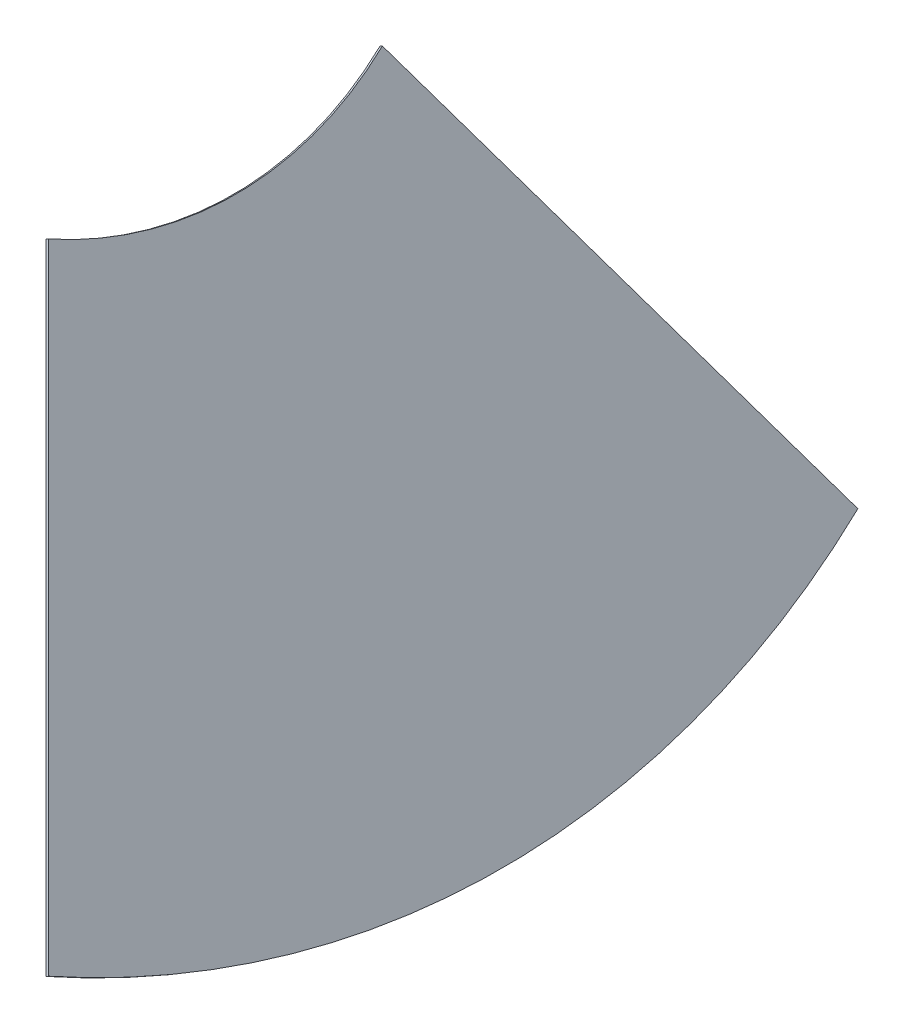
ISO-10303-21;
HEADER;
FILE_DESCRIPTION(('STEP AP214'),'2;1');
FILE_NAME('part.step','',(''),(''),'','','');
FILE_SCHEMA(('AUTOMOTIVE_DESIGN { 1 0 10303 214 1 1 1 1 }'));
ENDSEC;
DATA;
#1=APPLICATION_CONTEXT('core data for automotive mechanical design processes');
#2=APPLICATION_PROTOCOL_DEFINITION('international standard','automotive_design',2000,#1);
#3=PRODUCT_CONTEXT('',#1,'mechanical');
#4=PRODUCT('Part','Part','',(#3));
#5=PRODUCT_RELATED_PRODUCT_CATEGORY('part','',(#4));
#6=PRODUCT_DEFINITION_FORMATION('','',#4);
#7=PRODUCT_DEFINITION_CONTEXT('part definition',#1,'design');
#8=PRODUCT_DEFINITION('design','',#6,#7);
#9=PRODUCT_DEFINITION_SHAPE('','',#8);
#10=(LENGTH_UNIT() NAMED_UNIT(*) SI_UNIT(.MILLI.,.METRE.));
#11=(NAMED_UNIT(*) PLANE_ANGLE_UNIT() SI_UNIT($,.RADIAN.));
#12=(NAMED_UNIT(*) SI_UNIT($,.STERADIAN.) SOLID_ANGLE_UNIT());
#13=UNCERTAINTY_MEASURE_WITH_UNIT(LENGTH_MEASURE(1.E-05),#10,'distance_accuracy_value','');
#14=(GEOMETRIC_REPRESENTATION_CONTEXT(3) GLOBAL_UNCERTAINTY_ASSIGNED_CONTEXT((#13)) GLOBAL_UNIT_ASSIGNED_CONTEXT((#10,
#11,#12)) REPRESENTATION_CONTEXT('',''));
#15=CARTESIAN_POINT('',(0.,0.,0.));
#16=DIRECTION('',(0.,0.,1.));
#17=DIRECTION('',(1.,0.,0.));
#18=AXIS2_PLACEMENT_3D('',#15,#16,#17);
#19=CARTESIAN_POINT('',(38.5485374578257,22.87212089029,0.));
#20=DIRECTION('',(-0.860012120645906,-0.510273605374736,0.));
#21=DIRECTION('',(0.510273605374736,-0.860012120645906,0.));
#22=AXIS2_PLACEMENT_3D('',#19,#20,#21);
#23=PLANE('',#22);
#24=DIRECTION('',(-0.454519477672044,0.766044443118981,-0.454519477672039));
#25=VECTOR('',#24,1.);
#26=CARTESIAN_POINT('',(31.0734881622372,35.4705248228444,28.7083248729783));
#27=LINE('',#26,#25);
#28=CARTESIAN_POINT('',(180.235728869206,-215.926634660816,177.870565579945));
#29=VERTEX_POINT('',#28);
#30=CARTESIAN_POINT('',(75.6914234349291,-39.7282797567691,73.3262601456698));
#31=VERTEX_POINT('',#30);
#32=EDGE_CURVE('E127',#29,#31,#27,.T.);
#33=ORIENTED_EDGE('',*,*,#32,.F.);
#34=CARTESIAN_POINT('',(2.36512788773338,83.8554256679726,-3.54015250359858E-05));
#35=DIRECTION('',(-0.860012120645906,-0.510273605374736,0.));
#36=DIRECTION('',(0.510273605374736,-0.860012120645906,0.));
#37=AXIS2_PLACEMENT_3D('',#34,#35,#36);
#38=CIRCLE('',#37,391.337686764248);
#39=CARTESIAN_POINT('',(180.198905696345,-215.864573102768,-178.011986936182));
#40=VERTEX_POINT('',#39);
#41=EDGE_CURVE('E132',#29,#40,#38,.F.);
#42=ORIENTED_EDGE('',*,*,#41,.T.);
#43=DIRECTION('',(0.454519477672044,-0.76604444311898,-0.45451947767204));
#44=VECTOR('',#43,1.);
#45=CARTESIAN_POINT('',(31.0366649893771,35.5325863808923,-28.8497462292153));
#46=LINE('',#45,#44);
#47=CARTESIAN_POINT('',(75.6546002620691,-39.6662181987212,-73.4676815019069));
#48=VERTEX_POINT('',#47);
#49=EDGE_CURVE('E130',#48,#40,#46,.T.);
#50=ORIENTED_EDGE('',*,*,#49,.F.);
#51=CARTESIAN_POINT('',(2.36507751146295,83.8555105718413,-8.57777956146195E-05));
#52=DIRECTION('',(-0.860012120645906,-0.510273605374736,0.));
#53=DIRECTION('',(0.510273605374736,-0.860012120645906,0.));
#54=AXIS2_PLACEMENT_3D('',#51,#52,#53);
#55=CIRCLE('',#54,161.32718073828);
#56=EDGE_CURVE('E118',#31,#48,#55,.F.);
#57=ORIENTED_EDGE('',*,*,#56,.F.);
#58=EDGE_LOOP('',(#33,#42,#50,#57));
#59=FACE_BOUND('',#58,.T.);
#60=ADVANCED_FACE('F63',(#59),#23,.F.);
#61=CARTESIAN_POINT('',(1.27286211824265,83.2074630930153,-8.5777795613985E-05));
#62=DIRECTION('',(0.860012120645906,0.510273605374736,0.));
#63=DIRECTION('',(-0.510273605374736,0.860012120645906,0.));
#64=AXIS2_PLACEMENT_3D('',#61,#62,#63);
#65=CYLINDRICAL_SURFACE('',#64,161.32718073828);
#66=ORIENTED_EDGE('',*,*,#56,.T.);
#67=DIRECTION('',(0.860012120645906,0.510273605374736,0.));
#68=VECTOR('',#67,1.);
#69=CARTESIAN_POINT('',(74.5623848688488,-40.3142656775472,-73.4676815019069));
#70=LINE('',#69,#68);
#71=CARTESIAN_POINT('',(74.5623848688488,-40.3142656775472,-73.4676815019069));
#72=VERTEX_POINT('',#71);
#73=EDGE_CURVE('E72',#72,#48,#70,.T.);
#74=ORIENTED_EDGE('',*,*,#73,.F.);
#75=CARTESIAN_POINT('',(1.27286211824265,83.2074630930153,-8.5777795613985E-05));
#76=DIRECTION('',(-0.860012120645906,-0.510273605374736,0.));
#77=DIRECTION('',(0.510273605374736,-0.860012120645906,0.));
#78=AXIS2_PLACEMENT_3D('',#75,#76,#77);
#79=CIRCLE('',#78,161.32718073828);
#80=CARTESIAN_POINT('',(74.5992080417089,-40.376327235595,73.3262601456698));
#81=VERTEX_POINT('',#80);
#82=EDGE_CURVE('E106',#81,#72,#79,.F.);
#83=ORIENTED_EDGE('',*,*,#82,.F.);
#84=DIRECTION('',(0.860012120645906,0.510273605374736,0.));
#85=VECTOR('',#84,1.);
#86=CARTESIAN_POINT('',(74.5992080417089,-40.376327235595,73.3262601456698));
#87=LINE('',#86,#85);
#88=EDGE_CURVE('E12',#81,#31,#87,.T.);
#89=ORIENTED_EDGE('',*,*,#88,.T.);
#90=EDGE_LOOP('',(#66,#74,#83,#89));
#91=FACE_BOUND('',#90,.T.);
#92=ADVANCED_FACE('F117',(#91),#65,.F.);
#93=CARTESIAN_POINT('',(29.9812727690169,34.8224773440185,28.7083248729783));
#94=DIRECTION('',(0.231929292584753,-0.3908922598676,-0.890736798620522));
#95=DIRECTION('',(0.,0.915705667983333,-0.401849635589231));
#96=AXIS2_PLACEMENT_3D('',#93,#94,#95);
#97=PLANE('',#96);
#98=ORIENTED_EDGE('',*,*,#32,.T.);
#99=ORIENTED_EDGE('',*,*,#88,.F.);
#100=DIRECTION('',(-0.454519477672044,0.766044443118981,-0.454519477672039));
#101=VECTOR('',#100,1.);
#102=CARTESIAN_POINT('',(29.9812727690169,34.8224773440185,28.7083248729783));
#103=LINE('',#102,#101);
#104=CARTESIAN_POINT('',(179.143513475985,-216.574682139642,177.870565579945));
#105=VERTEX_POINT('',#104);
#106=EDGE_CURVE('E113',#105,#81,#103,.T.);
#107=ORIENTED_EDGE('',*,*,#106,.F.);
#108=DIRECTION('',(0.860012120645906,0.510273605374736,0.));
#109=VECTOR('',#108,1.);
#110=CARTESIAN_POINT('',(179.143513475985,-216.574682139642,177.870565579945));
#111=LINE('',#110,#109);
#112=EDGE_CURVE('E80',#105,#29,#111,.T.);
#113=ORIENTED_EDGE('',*,*,#112,.T.);
#114=EDGE_LOOP('',(#98,#99,#107,#113));
#115=FACE_BOUND('',#114,.T.);
#116=ADVANCED_FACE('F65',(#115),#97,.F.);
#117=CARTESIAN_POINT('',(1.27291249451308,83.2073781891466,-3.54015250353514E-05));
#118=DIRECTION('',(0.860012120645906,0.510273605374736,0.));
#119=DIRECTION('',(-0.510273605374736,0.860012120645906,0.));
#120=AXIS2_PLACEMENT_3D('',#117,#118,#119);
#121=CYLINDRICAL_SURFACE('',#120,391.337686764248);
#122=ORIENTED_EDGE('',*,*,#41,.F.);
#123=ORIENTED_EDGE('',*,*,#112,.F.);
#124=CARTESIAN_POINT('',(1.27291249451308,83.2073781891466,-3.54015250353514E-05));
#125=DIRECTION('',(-0.860012120645906,-0.510273605374736,0.));
#126=DIRECTION('',(0.510273605374736,-0.860012120645906,0.));
#127=AXIS2_PLACEMENT_3D('',#124,#125,#126);
#128=CIRCLE('',#127,391.337686764248);
#129=CARTESIAN_POINT('',(179.106690303125,-216.512620581594,-178.011986936182));
#130=VERTEX_POINT('',#129);
#131=EDGE_CURVE('E122',#105,#130,#128,.F.);
#132=ORIENTED_EDGE('',*,*,#131,.T.);
#133=DIRECTION('',(0.860012120645906,0.510273605374736,0.));
#134=VECTOR('',#133,1.);
#135=CARTESIAN_POINT('',(179.106690303125,-216.512620581594,-178.011986936182));
#136=LINE('',#135,#134);
#137=EDGE_CURVE('E95',#130,#40,#136,.T.);
#138=ORIENTED_EDGE('',*,*,#137,.T.);
#139=EDGE_LOOP('',(#122,#123,#132,#138));
#140=FACE_BOUND('',#139,.T.);
#141=ADVANCED_FACE('F137',(#140),#121,.T.);
#142=CARTESIAN_POINT('',(29.9444495961568,34.8845389020664,-28.8497462292153));
#143=DIRECTION('',(0.231929292584754,-0.3908922598676,0.890736798620522));
#144=DIRECTION('',(0.,-0.915705667983333,-0.401849635589231));
#145=AXIS2_PLACEMENT_3D('',#142,#143,#144);
#146=PLANE('',#145);
#147=ORIENTED_EDGE('',*,*,#49,.T.);
#148=ORIENTED_EDGE('',*,*,#137,.F.);
#149=DIRECTION('',(0.454519477672044,-0.76604444311898,-0.45451947767204));
#150=VECTOR('',#149,1.);
#151=CARTESIAN_POINT('',(29.9444495961568,34.8845389020664,-28.8497462292153));
#152=LINE('',#151,#150);
#153=EDGE_CURVE('E112',#72,#130,#152,.T.);
#154=ORIENTED_EDGE('',*,*,#153,.F.);
#155=ORIENTED_EDGE('',*,*,#73,.T.);
#156=EDGE_LOOP('',(#147,#148,#154,#155));
#157=FACE_BOUND('',#156,.T.);
#158=ADVANCED_FACE('F121',(#157),#146,.F.);
#159=CARTESIAN_POINT('',(37.4563220646054,22.224073411464,0.));
#160=DIRECTION('',(-0.860012120645906,-0.510273605374736,0.));
#161=DIRECTION('',(0.510273605374736,-0.860012120645906,0.));
#162=AXIS2_PLACEMENT_3D('',#159,#160,#161);
#163=PLANE('',#162);
#164=ORIENTED_EDGE('',*,*,#106,.T.);
#165=ORIENTED_EDGE('',*,*,#82,.T.);
#166=ORIENTED_EDGE('',*,*,#153,.T.);
#167=ORIENTED_EDGE('',*,*,#131,.F.);
#168=EDGE_LOOP('',(#164,#165,#166,#167));
#169=FACE_BOUND('',#168,.T.);
#170=ADVANCED_FACE('F109',(#169),#163,.T.);
#171=CLOSED_SHELL('',(#60,#92,#116,#141,#158,#170));
#172=MANIFOLD_SOLID_BREP('B2',#171);
#173=ADVANCED_BREP_SHAPE_REPRESENTATION('',(#18,#172),#14);
#174=SHAPE_DEFINITION_REPRESENTATION(#9,#173);
ENDSEC;
END-ISO-10303-21;
